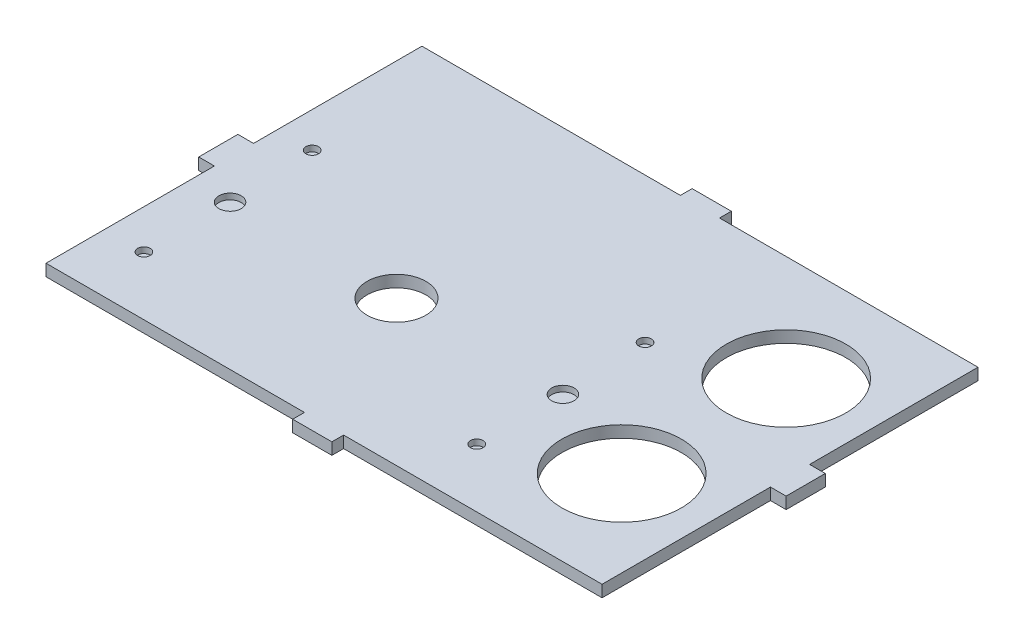
ISO-10303-21;
HEADER;
FILE_DESCRIPTION(('STEP AP214'),'2;1');
FILE_NAME('part.step','',(''),(''),'','','');
FILE_SCHEMA(('AUTOMOTIVE_DESIGN { 1 0 10303 214 1 1 1 1 }'));
ENDSEC;
DATA;
#1=APPLICATION_CONTEXT('core data for automotive mechanical design processes');
#2=APPLICATION_PROTOCOL_DEFINITION('international standard','automotive_design',2000,#1);
#3=PRODUCT_CONTEXT('',#1,'mechanical');
#4=PRODUCT('Part','Part','',(#3));
#5=PRODUCT_RELATED_PRODUCT_CATEGORY('part','',(#4));
#6=PRODUCT_DEFINITION_FORMATION('','',#4);
#7=PRODUCT_DEFINITION_CONTEXT('part definition',#1,'design');
#8=PRODUCT_DEFINITION('design','',#6,#7);
#9=PRODUCT_DEFINITION_SHAPE('','',#8);
#10=(LENGTH_UNIT() NAMED_UNIT(*) SI_UNIT(.MILLI.,.METRE.));
#11=(NAMED_UNIT(*) PLANE_ANGLE_UNIT() SI_UNIT($,.RADIAN.));
#12=(NAMED_UNIT(*) SI_UNIT($,.STERADIAN.) SOLID_ANGLE_UNIT());
#13=UNCERTAINTY_MEASURE_WITH_UNIT(LENGTH_MEASURE(1.E-05),#10,'distance_accuracy_value','');
#14=(GEOMETRIC_REPRESENTATION_CONTEXT(3) GLOBAL_UNCERTAINTY_ASSIGNED_CONTEXT((#13)) GLOBAL_UNIT_ASSIGNED_CONTEXT((#10,
#11,#12)) REPRESENTATION_CONTEXT('',''));
#15=CARTESIAN_POINT('',(0.,0.,0.));
#16=DIRECTION('',(0.,0.,1.));
#17=DIRECTION('',(1.,0.,0.));
#18=AXIS2_PLACEMENT_3D('',#15,#16,#17);
#19=CARTESIAN_POINT('',(4.99999999999998,3.,48.));
#20=DIRECTION('',(0.,0.,-1.));
#21=DIRECTION('',(-1.,0.,0.));
#22=AXIS2_PLACEMENT_3D('',#19,#20,#21);
#23=PLANE('',#22);
#24=DIRECTION('',(1.,0.,0.));
#25=VECTOR('',#24,1.);
#26=CARTESIAN_POINT('',(4.99999999999998,0.,48.));
#27=LINE('',#26,#25);
#28=CARTESIAN_POINT('',(4.99999999999998,0.,48.));
#29=VERTEX_POINT('',#28);
#30=CARTESIAN_POINT('',(71.,0.,48.));
#31=VERTEX_POINT('',#30);
#32=EDGE_CURVE('E203',#29,#31,#27,.T.);
#33=ORIENTED_EDGE('',*,*,#32,.T.);
#34=DIRECTION('',(0.,-1.,0.));
#35=VECTOR('',#34,1.);
#36=CARTESIAN_POINT('',(71.,3.,48.));
#37=LINE('',#36,#35);
#38=CARTESIAN_POINT('',(71.,3.,48.));
#39=VERTEX_POINT('',#38);
#40=EDGE_CURVE('E11',#39,#31,#37,.T.);
#41=ORIENTED_EDGE('',*,*,#40,.F.);
#42=DIRECTION('',(1.,0.,0.));
#43=VECTOR('',#42,1.);
#44=CARTESIAN_POINT('',(4.99999999999998,3.,48.));
#45=LINE('',#44,#43);
#46=CARTESIAN_POINT('',(4.99999999999998,3.,48.));
#47=VERTEX_POINT('',#46);
#48=EDGE_CURVE('E242',#47,#39,#45,.T.);
#49=ORIENTED_EDGE('',*,*,#48,.F.);
#50=DIRECTION('',(0.,-1.,0.));
#51=VECTOR('',#50,1.);
#52=CARTESIAN_POINT('',(4.99999999999998,3.,48.));
#53=LINE('',#52,#51);
#54=EDGE_CURVE('E199',#47,#29,#53,.T.);
#55=ORIENTED_EDGE('',*,*,#54,.T.);
#56=EDGE_LOOP('',(#33,#41,#49,#55));
#57=FACE_BOUND('',#56,.T.);
#58=ADVANCED_FACE('F35',(#57),#23,.F.);
#59=CARTESIAN_POINT('',(71.,3.,5.00000000000001));
#60=DIRECTION('',(-1.,0.,0.));
#61=DIRECTION('',(0.,0.,1.));
#62=AXIS2_PLACEMENT_3D('',#59,#60,#61);
#63=PLANE('',#62);
#64=DIRECTION('',(0.,0.,-1.));
#65=VECTOR('',#64,1.);
#66=CARTESIAN_POINT('',(71.,0.,5.00000000000001));
#67=LINE('',#66,#65);
#68=CARTESIAN_POINT('',(71.,0.,5.00000000000001));
#69=VERTEX_POINT('',#68);
#70=EDGE_CURVE('E206',#31,#69,#67,.T.);
#71=ORIENTED_EDGE('',*,*,#70,.T.);
#72=DIRECTION('',(0.,-1.,0.));
#73=VECTOR('',#72,1.);
#74=CARTESIAN_POINT('',(71.,3.,5.00000000000001));
#75=LINE('',#74,#73);
#76=CARTESIAN_POINT('',(71.,3.,5.00000000000001));
#77=VERTEX_POINT('',#76);
#78=EDGE_CURVE('E43',#77,#69,#75,.T.);
#79=ORIENTED_EDGE('',*,*,#78,.F.);
#80=DIRECTION('',(0.,0.,-1.));
#81=VECTOR('',#80,1.);
#82=CARTESIAN_POINT('',(71.,3.,5.00000000000001));
#83=LINE('',#82,#81);
#84=EDGE_CURVE('E130',#39,#77,#83,.T.);
#85=ORIENTED_EDGE('',*,*,#84,.F.);
#86=ORIENTED_EDGE('',*,*,#40,.T.);
#87=EDGE_LOOP('',(#71,#79,#85,#86));
#88=FACE_BOUND('',#87,.T.);
#89=ADVANCED_FACE('F361',(#88),#63,.F.);
#90=CARTESIAN_POINT('',(71.,3.,5.00000000000001));
#91=DIRECTION('',(0.,0.,-1.));
#92=DIRECTION('',(-1.,0.,0.));
#93=AXIS2_PLACEMENT_3D('',#90,#91,#92);
#94=PLANE('',#93);
#95=DIRECTION('',(1.,0.,0.));
#96=VECTOR('',#95,1.);
#97=CARTESIAN_POINT('',(71.,0.,5.00000000000001));
#98=LINE('',#97,#96);
#99=CARTESIAN_POINT('',(75.,0.,5.00000000000001));
#100=VERTEX_POINT('',#99);
#101=EDGE_CURVE('E209',#69,#100,#98,.T.);
#102=ORIENTED_EDGE('',*,*,#101,.T.);
#103=DIRECTION('',(0.,-1.,0.));
#104=VECTOR('',#103,1.);
#105=CARTESIAN_POINT('',(75.,3.,5.00000000000001));
#106=LINE('',#105,#104);
#107=CARTESIAN_POINT('',(75.,3.,5.00000000000001));
#108=VERTEX_POINT('',#107);
#109=EDGE_CURVE('E285',#108,#100,#106,.T.);
#110=ORIENTED_EDGE('',*,*,#109,.F.);
#111=DIRECTION('',(1.,0.,0.));
#112=VECTOR('',#111,1.);
#113=CARTESIAN_POINT('',(71.,3.,5.00000000000001));
#114=LINE('',#113,#112);
#115=EDGE_CURVE('E293',#77,#108,#114,.T.);
#116=ORIENTED_EDGE('',*,*,#115,.F.);
#117=ORIENTED_EDGE('',*,*,#78,.T.);
#118=EDGE_LOOP('',(#102,#110,#116,#117));
#119=FACE_BOUND('',#118,.T.);
#120=ADVANCED_FACE('F291',(#119),#94,.F.);
#121=CARTESIAN_POINT('',(75.,3.,-4.99999999999999));
#122=DIRECTION('',(-1.,0.,0.));
#123=DIRECTION('',(0.,0.,1.));
#124=AXIS2_PLACEMENT_3D('',#121,#122,#123);
#125=PLANE('',#124);
#126=DIRECTION('',(0.,0.,-1.));
#127=VECTOR('',#126,1.);
#128=CARTESIAN_POINT('',(75.,0.,-4.99999999999999));
#129=LINE('',#128,#127);
#130=CARTESIAN_POINT('',(75.,0.,-4.99999999999999));
#131=VERTEX_POINT('',#130);
#132=EDGE_CURVE('E211',#100,#131,#129,.T.);
#133=ORIENTED_EDGE('',*,*,#132,.T.);
#134=DIRECTION('',(0.,-1.,0.));
#135=VECTOR('',#134,1.);
#136=CARTESIAN_POINT('',(75.,3.,-4.99999999999999));
#137=LINE('',#136,#135);
#138=CARTESIAN_POINT('',(75.,3.,-4.99999999999999));
#139=VERTEX_POINT('',#138);
#140=EDGE_CURVE('E282',#139,#131,#137,.T.);
#141=ORIENTED_EDGE('',*,*,#140,.F.);
#142=DIRECTION('',(0.,0.,-1.));
#143=VECTOR('',#142,1.);
#144=CARTESIAN_POINT('',(75.,3.,-4.99999999999999));
#145=LINE('',#144,#143);
#146=EDGE_CURVE('E311',#108,#139,#145,.T.);
#147=ORIENTED_EDGE('',*,*,#146,.F.);
#148=ORIENTED_EDGE('',*,*,#109,.T.);
#149=EDGE_LOOP('',(#133,#141,#147,#148));
#150=FACE_BOUND('',#149,.T.);
#151=ADVANCED_FACE('F302',(#150),#125,.F.);
#152=CARTESIAN_POINT('',(71.,3.,-4.99999999999999));
#153=DIRECTION('',(0.,0.,1.));
#154=DIRECTION('',(1.,0.,0.));
#155=AXIS2_PLACEMENT_3D('',#152,#153,#154);
#156=PLANE('',#155);
#157=DIRECTION('',(-1.,0.,0.));
#158=VECTOR('',#157,1.);
#159=CARTESIAN_POINT('',(71.,0.,-4.99999999999999));
#160=LINE('',#159,#158);
#161=CARTESIAN_POINT('',(71.,0.,-4.99999999999999));
#162=VERTEX_POINT('',#161);
#163=EDGE_CURVE('E213',#131,#162,#160,.T.);
#164=ORIENTED_EDGE('',*,*,#163,.T.);
#165=DIRECTION('',(0.,-1.,0.));
#166=VECTOR('',#165,1.);
#167=CARTESIAN_POINT('',(71.,3.,-4.99999999999999));
#168=LINE('',#167,#166);
#169=CARTESIAN_POINT('',(71.,3.,-4.99999999999999));
#170=VERTEX_POINT('',#169);
#171=EDGE_CURVE('E279',#170,#162,#168,.T.);
#172=ORIENTED_EDGE('',*,*,#171,.F.);
#173=DIRECTION('',(-1.,0.,0.));
#174=VECTOR('',#173,1.);
#175=CARTESIAN_POINT('',(71.,3.,-4.99999999999999));
#176=LINE('',#175,#174);
#177=EDGE_CURVE('E308',#139,#170,#176,.T.);
#178=ORIENTED_EDGE('',*,*,#177,.F.);
#179=ORIENTED_EDGE('',*,*,#140,.T.);
#180=EDGE_LOOP('',(#164,#172,#178,#179));
#181=FACE_BOUND('',#180,.T.);
#182=ADVANCED_FACE('F306',(#181),#156,.F.);
#183=CARTESIAN_POINT('',(71.,3.,-48.));
#184=DIRECTION('',(-1.,0.,0.));
#185=DIRECTION('',(0.,0.,1.));
#186=AXIS2_PLACEMENT_3D('',#183,#184,#185);
#187=PLANE('',#186);
#188=DIRECTION('',(0.,0.,-1.));
#189=VECTOR('',#188,1.);
#190=CARTESIAN_POINT('',(71.,0.,-48.));
#191=LINE('',#190,#189);
#192=CARTESIAN_POINT('',(71.,0.,-48.));
#193=VERTEX_POINT('',#192);
#194=EDGE_CURVE('E215',#162,#193,#191,.T.);
#195=ORIENTED_EDGE('',*,*,#194,.T.);
#196=DIRECTION('',(0.,-1.,0.));
#197=VECTOR('',#196,1.);
#198=CARTESIAN_POINT('',(71.,3.,-48.));
#199=LINE('',#198,#197);
#200=CARTESIAN_POINT('',(71.,3.,-48.));
#201=VERTEX_POINT('',#200);
#202=EDGE_CURVE('E276',#201,#193,#199,.T.);
#203=ORIENTED_EDGE('',*,*,#202,.F.);
#204=DIRECTION('',(0.,0.,-1.));
#205=VECTOR('',#204,1.);
#206=CARTESIAN_POINT('',(71.,3.,-48.));
#207=LINE('',#206,#205);
#208=EDGE_CURVE('E310',#170,#201,#207,.T.);
#209=ORIENTED_EDGE('',*,*,#208,.F.);
#210=ORIENTED_EDGE('',*,*,#171,.T.);
#211=EDGE_LOOP('',(#195,#203,#209,#210));
#212=FACE_BOUND('',#211,.T.);
#213=ADVANCED_FACE('F374',(#212),#187,.F.);
#214=CARTESIAN_POINT('',(4.99999999999998,3.,-48.));
#215=DIRECTION('',(0.,0.,1.));
#216=DIRECTION('',(1.,0.,0.));
#217=AXIS2_PLACEMENT_3D('',#214,#215,#216);
#218=PLANE('',#217);
#219=DIRECTION('',(-1.,0.,0.));
#220=VECTOR('',#219,1.);
#221=CARTESIAN_POINT('',(4.99999999999998,0.,-48.));
#222=LINE('',#221,#220);
#223=CARTESIAN_POINT('',(4.99999999999998,0.,-48.));
#224=VERTEX_POINT('',#223);
#225=EDGE_CURVE('E217',#193,#224,#222,.T.);
#226=ORIENTED_EDGE('',*,*,#225,.T.);
#227=DIRECTION('',(0.,-1.,0.));
#228=VECTOR('',#227,1.);
#229=CARTESIAN_POINT('',(4.99999999999998,3.,-48.));
#230=LINE('',#229,#228);
#231=CARTESIAN_POINT('',(4.99999999999998,3.,-48.));
#232=VERTEX_POINT('',#231);
#233=EDGE_CURVE('E273',#232,#224,#230,.T.);
#234=ORIENTED_EDGE('',*,*,#233,.F.);
#235=DIRECTION('',(-1.,0.,0.));
#236=VECTOR('',#235,1.);
#237=CARTESIAN_POINT('',(4.99999999999998,3.,-48.));
#238=LINE('',#237,#236);
#239=EDGE_CURVE('E313',#201,#232,#238,.T.);
#240=ORIENTED_EDGE('',*,*,#239,.F.);
#241=ORIENTED_EDGE('',*,*,#202,.T.);
#242=EDGE_LOOP('',(#226,#234,#240,#241));
#243=FACE_BOUND('',#242,.T.);
#244=ADVANCED_FACE('F377',(#243),#218,.F.);
#245=CARTESIAN_POINT('',(4.99999999999998,3.,-48.));
#246=DIRECTION('',(-1.,0.,0.));
#247=DIRECTION('',(0.,0.,1.));
#248=AXIS2_PLACEMENT_3D('',#245,#246,#247);
#249=PLANE('',#248);
#250=DIRECTION('',(0.,0.,-1.));
#251=VECTOR('',#250,1.);
#252=CARTESIAN_POINT('',(4.99999999999998,0.,-48.));
#253=LINE('',#252,#251);
#254=CARTESIAN_POINT('',(4.99999999999998,0.,-51.));
#255=VERTEX_POINT('',#254);
#256=EDGE_CURVE('E219',#224,#255,#253,.T.);
#257=ORIENTED_EDGE('',*,*,#256,.T.);
#258=DIRECTION('',(0.,-1.,0.));
#259=VECTOR('',#258,1.);
#260=CARTESIAN_POINT('',(4.99999999999998,3.,-51.));
#261=LINE('',#260,#259);
#262=CARTESIAN_POINT('',(4.99999999999998,3.,-51.));
#263=VERTEX_POINT('',#262);
#264=EDGE_CURVE('E270',#263,#255,#261,.T.);
#265=ORIENTED_EDGE('',*,*,#264,.F.);
#266=DIRECTION('',(0.,0.,-1.));
#267=VECTOR('',#266,1.);
#268=CARTESIAN_POINT('',(4.99999999999998,3.,-48.));
#269=LINE('',#268,#267);
#270=EDGE_CURVE('E319',#232,#263,#269,.T.);
#271=ORIENTED_EDGE('',*,*,#270,.F.);
#272=ORIENTED_EDGE('',*,*,#233,.T.);
#273=EDGE_LOOP('',(#257,#265,#271,#272));
#274=FACE_BOUND('',#273,.T.);
#275=ADVANCED_FACE('F381',(#274),#249,.F.);
#276=CARTESIAN_POINT('',(-5.00000000000002,3.,-51.));
#277=DIRECTION('',(0.,0.,1.));
#278=DIRECTION('',(1.,0.,0.));
#279=AXIS2_PLACEMENT_3D('',#276,#277,#278);
#280=PLANE('',#279);
#281=DIRECTION('',(-1.,0.,0.));
#282=VECTOR('',#281,1.);
#283=CARTESIAN_POINT('',(-5.00000000000002,0.,-51.));
#284=LINE('',#283,#282);
#285=CARTESIAN_POINT('',(-5.00000000000002,0.,-51.));
#286=VERTEX_POINT('',#285);
#287=EDGE_CURVE('E221',#255,#286,#284,.T.);
#288=ORIENTED_EDGE('',*,*,#287,.T.);
#289=DIRECTION('',(0.,-1.,0.));
#290=VECTOR('',#289,1.);
#291=CARTESIAN_POINT('',(-5.00000000000002,3.,-51.));
#292=LINE('',#291,#290);
#293=CARTESIAN_POINT('',(-5.00000000000002,3.,-51.));
#294=VERTEX_POINT('',#293);
#295=EDGE_CURVE('E267',#294,#286,#292,.T.);
#296=ORIENTED_EDGE('',*,*,#295,.F.);
#297=DIRECTION('',(-1.,0.,0.));
#298=VECTOR('',#297,1.);
#299=CARTESIAN_POINT('',(-5.00000000000002,3.,-51.));
#300=LINE('',#299,#298);
#301=EDGE_CURVE('E321',#263,#294,#300,.T.);
#302=ORIENTED_EDGE('',*,*,#301,.F.);
#303=ORIENTED_EDGE('',*,*,#264,.T.);
#304=EDGE_LOOP('',(#288,#296,#302,#303));
#305=FACE_BOUND('',#304,.T.);
#306=ADVANCED_FACE('F385',(#305),#280,.F.);
#307=CARTESIAN_POINT('',(-5.00000000000002,3.,-48.));
#308=DIRECTION('',(1.,0.,0.));
#309=DIRECTION('',(0.,0.,-1.));
#310=AXIS2_PLACEMENT_3D('',#307,#308,#309);
#311=PLANE('',#310);
#312=DIRECTION('',(0.,0.,1.));
#313=VECTOR('',#312,1.);
#314=CARTESIAN_POINT('',(-5.00000000000002,0.,-48.));
#315=LINE('',#314,#313);
#316=CARTESIAN_POINT('',(-5.00000000000002,0.,-48.));
#317=VERTEX_POINT('',#316);
#318=EDGE_CURVE('E223',#286,#317,#315,.T.);
#319=ORIENTED_EDGE('',*,*,#318,.T.);
#320=DIRECTION('',(0.,-1.,0.));
#321=VECTOR('',#320,1.);
#322=CARTESIAN_POINT('',(-5.00000000000002,3.,-48.));
#323=LINE('',#322,#321);
#324=CARTESIAN_POINT('',(-5.00000000000002,3.,-48.));
#325=VERTEX_POINT('',#324);
#326=EDGE_CURVE('E264',#325,#317,#323,.T.);
#327=ORIENTED_EDGE('',*,*,#326,.F.);
#328=DIRECTION('',(0.,0.,1.));
#329=VECTOR('',#328,1.);
#330=CARTESIAN_POINT('',(-5.00000000000002,3.,-48.));
#331=LINE('',#330,#329);
#332=EDGE_CURVE('E323',#294,#325,#331,.T.);
#333=ORIENTED_EDGE('',*,*,#332,.F.);
#334=ORIENTED_EDGE('',*,*,#295,.T.);
#335=EDGE_LOOP('',(#319,#327,#333,#334));
#336=FACE_BOUND('',#335,.T.);
#337=ADVANCED_FACE('F389',(#336),#311,.F.);
#338=CARTESIAN_POINT('',(-71.,3.,-48.));
#339=DIRECTION('',(0.,0.,1.));
#340=DIRECTION('',(1.,0.,0.));
#341=AXIS2_PLACEMENT_3D('',#338,#339,#340);
#342=PLANE('',#341);
#343=DIRECTION('',(-1.,0.,0.));
#344=VECTOR('',#343,1.);
#345=CARTESIAN_POINT('',(-71.,0.,-48.));
#346=LINE('',#345,#344);
#347=CARTESIAN_POINT('',(-71.,0.,-48.));
#348=VERTEX_POINT('',#347);
#349=EDGE_CURVE('E225',#317,#348,#346,.T.);
#350=ORIENTED_EDGE('',*,*,#349,.T.);
#351=DIRECTION('',(0.,-1.,0.));
#352=VECTOR('',#351,1.);
#353=CARTESIAN_POINT('',(-71.,3.,-48.));
#354=LINE('',#353,#352);
#355=CARTESIAN_POINT('',(-71.,3.,-48.));
#356=VERTEX_POINT('',#355);
#357=EDGE_CURVE('E261',#356,#348,#354,.T.);
#358=ORIENTED_EDGE('',*,*,#357,.F.);
#359=DIRECTION('',(-1.,0.,0.));
#360=VECTOR('',#359,1.);
#361=CARTESIAN_POINT('',(-71.,3.,-48.));
#362=LINE('',#361,#360);
#363=EDGE_CURVE('E325',#325,#356,#362,.T.);
#364=ORIENTED_EDGE('',*,*,#363,.F.);
#365=ORIENTED_EDGE('',*,*,#326,.T.);
#366=EDGE_LOOP('',(#350,#358,#364,#365));
#367=FACE_BOUND('',#366,.T.);
#368=ADVANCED_FACE('F393',(#367),#342,.F.);
#369=CARTESIAN_POINT('',(-71.,3.,-48.));
#370=DIRECTION('',(1.,0.,0.));
#371=DIRECTION('',(0.,0.,-1.));
#372=AXIS2_PLACEMENT_3D('',#369,#370,#371);
#373=PLANE('',#372);
#374=DIRECTION('',(0.,0.,1.));
#375=VECTOR('',#374,1.);
#376=CARTESIAN_POINT('',(-71.,0.,-48.));
#377=LINE('',#376,#375);
#378=CARTESIAN_POINT('',(-71.,0.,-4.99999999999999));
#379=VERTEX_POINT('',#378);
#380=EDGE_CURVE('E227',#348,#379,#377,.T.);
#381=ORIENTED_EDGE('',*,*,#380,.T.);
#382=DIRECTION('',(0.,-1.,0.));
#383=VECTOR('',#382,1.);
#384=CARTESIAN_POINT('',(-71.,3.,-4.99999999999999));
#385=LINE('',#384,#383);
#386=CARTESIAN_POINT('',(-71.,3.,-4.99999999999999));
#387=VERTEX_POINT('',#386);
#388=EDGE_CURVE('E258',#387,#379,#385,.T.);
#389=ORIENTED_EDGE('',*,*,#388,.F.);
#390=DIRECTION('',(0.,0.,1.));
#391=VECTOR('',#390,1.);
#392=CARTESIAN_POINT('',(-71.,3.,-48.));
#393=LINE('',#392,#391);
#394=EDGE_CURVE('E327',#356,#387,#393,.T.);
#395=ORIENTED_EDGE('',*,*,#394,.F.);
#396=ORIENTED_EDGE('',*,*,#357,.T.);
#397=EDGE_LOOP('',(#381,#389,#395,#396));
#398=FACE_BOUND('',#397,.T.);
#399=ADVANCED_FACE('F397',(#398),#373,.F.);
#400=CARTESIAN_POINT('',(-75.,3.,-4.99999999999999));
#401=DIRECTION('',(0.,0.,1.));
#402=DIRECTION('',(1.,0.,0.));
#403=AXIS2_PLACEMENT_3D('',#400,#401,#402);
#404=PLANE('',#403);
#405=DIRECTION('',(-1.,0.,0.));
#406=VECTOR('',#405,1.);
#407=CARTESIAN_POINT('',(-75.,0.,-4.99999999999999));
#408=LINE('',#407,#406);
#409=CARTESIAN_POINT('',(-75.,0.,-4.99999999999999));
#410=VERTEX_POINT('',#409);
#411=EDGE_CURVE('E229',#379,#410,#408,.T.);
#412=ORIENTED_EDGE('',*,*,#411,.T.);
#413=DIRECTION('',(0.,-1.,0.));
#414=VECTOR('',#413,1.);
#415=CARTESIAN_POINT('',(-75.,3.,-4.99999999999999));
#416=LINE('',#415,#414);
#417=CARTESIAN_POINT('',(-75.,3.,-4.99999999999999));
#418=VERTEX_POINT('',#417);
#419=EDGE_CURVE('E255',#418,#410,#416,.T.);
#420=ORIENTED_EDGE('',*,*,#419,.F.);
#421=DIRECTION('',(-1.,0.,0.));
#422=VECTOR('',#421,1.);
#423=CARTESIAN_POINT('',(-75.,3.,-4.99999999999999));
#424=LINE('',#423,#422);
#425=EDGE_CURVE('E329',#387,#418,#424,.T.);
#426=ORIENTED_EDGE('',*,*,#425,.F.);
#427=ORIENTED_EDGE('',*,*,#388,.T.);
#428=EDGE_LOOP('',(#412,#420,#426,#427));
#429=FACE_BOUND('',#428,.T.);
#430=ADVANCED_FACE('F401',(#429),#404,.F.);
#431=CARTESIAN_POINT('',(-75.,3.,-4.99999999999999));
#432=DIRECTION('',(1.,0.,0.));
#433=DIRECTION('',(0.,0.,-1.));
#434=AXIS2_PLACEMENT_3D('',#431,#432,#433);
#435=PLANE('',#434);
#436=DIRECTION('',(0.,0.,1.));
#437=VECTOR('',#436,1.);
#438=CARTESIAN_POINT('',(-75.,0.,-4.99999999999999));
#439=LINE('',#438,#437);
#440=CARTESIAN_POINT('',(-75.,0.,5.00000000000001));
#441=VERTEX_POINT('',#440);
#442=EDGE_CURVE('E231',#410,#441,#439,.T.);
#443=ORIENTED_EDGE('',*,*,#442,.T.);
#444=DIRECTION('',(0.,-1.,0.));
#445=VECTOR('',#444,1.);
#446=CARTESIAN_POINT('',(-75.,3.,5.00000000000001));
#447=LINE('',#446,#445);
#448=CARTESIAN_POINT('',(-75.,3.,5.00000000000001));
#449=VERTEX_POINT('',#448);
#450=EDGE_CURVE('E252',#449,#441,#447,.T.);
#451=ORIENTED_EDGE('',*,*,#450,.F.);
#452=DIRECTION('',(0.,0.,1.));
#453=VECTOR('',#452,1.);
#454=CARTESIAN_POINT('',(-75.,3.,-4.99999999999999));
#455=LINE('',#454,#453);
#456=EDGE_CURVE('E331',#418,#449,#455,.T.);
#457=ORIENTED_EDGE('',*,*,#456,.F.);
#458=ORIENTED_EDGE('',*,*,#419,.T.);
#459=EDGE_LOOP('',(#443,#451,#457,#458));
#460=FACE_BOUND('',#459,.T.);
#461=ADVANCED_FACE('F405',(#460),#435,.F.);
#462=CARTESIAN_POINT('',(-75.,3.,5.00000000000001));
#463=DIRECTION('',(0.,0.,-1.));
#464=DIRECTION('',(-1.,0.,0.));
#465=AXIS2_PLACEMENT_3D('',#462,#463,#464);
#466=PLANE('',#465);
#467=DIRECTION('',(1.,0.,0.));
#468=VECTOR('',#467,1.);
#469=CARTESIAN_POINT('',(-75.,0.,5.00000000000001));
#470=LINE('',#469,#468);
#471=CARTESIAN_POINT('',(-71.,0.,5.00000000000001));
#472=VERTEX_POINT('',#471);
#473=EDGE_CURVE('E233',#441,#472,#470,.T.);
#474=ORIENTED_EDGE('',*,*,#473,.T.);
#475=DIRECTION('',(0.,-1.,0.));
#476=VECTOR('',#475,1.);
#477=CARTESIAN_POINT('',(-71.,3.,5.00000000000001));
#478=LINE('',#477,#476);
#479=CARTESIAN_POINT('',(-71.,3.,5.00000000000001));
#480=VERTEX_POINT('',#479);
#481=EDGE_CURVE('E249',#480,#472,#478,.T.);
#482=ORIENTED_EDGE('',*,*,#481,.F.);
#483=DIRECTION('',(1.,0.,0.));
#484=VECTOR('',#483,1.);
#485=CARTESIAN_POINT('',(-75.,3.,5.00000000000001));
#486=LINE('',#485,#484);
#487=EDGE_CURVE('E333',#449,#480,#486,.T.);
#488=ORIENTED_EDGE('',*,*,#487,.F.);
#489=ORIENTED_EDGE('',*,*,#450,.T.);
#490=EDGE_LOOP('',(#474,#482,#488,#489));
#491=FACE_BOUND('',#490,.T.);
#492=ADVANCED_FACE('F409',(#491),#466,.F.);
#493=CARTESIAN_POINT('',(-71.,3.,5.00000000000001));
#494=DIRECTION('',(1.,0.,0.));
#495=DIRECTION('',(0.,0.,-1.));
#496=AXIS2_PLACEMENT_3D('',#493,#494,#495);
#497=PLANE('',#496);
#498=DIRECTION('',(0.,0.,1.));
#499=VECTOR('',#498,1.);
#500=CARTESIAN_POINT('',(-71.,0.,5.00000000000001));
#501=LINE('',#500,#499);
#502=CARTESIAN_POINT('',(-71.,0.,48.));
#503=VERTEX_POINT('',#502);
#504=EDGE_CURVE('E235',#472,#503,#501,.T.);
#505=ORIENTED_EDGE('',*,*,#504,.T.);
#506=DIRECTION('',(0.,-1.,0.));
#507=VECTOR('',#506,1.);
#508=CARTESIAN_POINT('',(-71.,3.,48.));
#509=LINE('',#508,#507);
#510=CARTESIAN_POINT('',(-71.,3.,48.));
#511=VERTEX_POINT('',#510);
#512=EDGE_CURVE('E246',#511,#503,#509,.T.);
#513=ORIENTED_EDGE('',*,*,#512,.F.);
#514=DIRECTION('',(0.,0.,1.));
#515=VECTOR('',#514,1.);
#516=CARTESIAN_POINT('',(-71.,3.,5.00000000000001));
#517=LINE('',#516,#515);
#518=EDGE_CURVE('E335',#480,#511,#517,.T.);
#519=ORIENTED_EDGE('',*,*,#518,.F.);
#520=ORIENTED_EDGE('',*,*,#481,.T.);
#521=EDGE_LOOP('',(#505,#513,#519,#520));
#522=FACE_BOUND('',#521,.T.);
#523=ADVANCED_FACE('F341',(#522),#497,.F.);
#524=CARTESIAN_POINT('',(-71.,3.,48.));
#525=DIRECTION('',(0.,0.,-1.));
#526=DIRECTION('',(-1.,0.,0.));
#527=AXIS2_PLACEMENT_3D('',#524,#525,#526);
#528=PLANE('',#527);
#529=DIRECTION('',(1.,0.,0.));
#530=VECTOR('',#529,1.);
#531=CARTESIAN_POINT('',(-71.,0.,48.));
#532=LINE('',#531,#530);
#533=CARTESIAN_POINT('',(-5.00000000000002,0.,48.));
#534=VERTEX_POINT('',#533);
#535=EDGE_CURVE('E237',#503,#534,#532,.T.);
#536=ORIENTED_EDGE('',*,*,#535,.T.);
#537=DIRECTION('',(0.,-1.,0.));
#538=VECTOR('',#537,1.);
#539=CARTESIAN_POINT('',(-5.00000000000002,3.,48.));
#540=LINE('',#539,#538);
#541=CARTESIAN_POINT('',(-5.00000000000002,3.,48.));
#542=VERTEX_POINT('',#541);
#543=EDGE_CURVE('E194',#542,#534,#540,.T.);
#544=ORIENTED_EDGE('',*,*,#543,.F.);
#545=DIRECTION('',(1.,0.,0.));
#546=VECTOR('',#545,1.);
#547=CARTESIAN_POINT('',(-71.,3.,48.));
#548=LINE('',#547,#546);
#549=EDGE_CURVE('E185',#511,#542,#548,.T.);
#550=ORIENTED_EDGE('',*,*,#549,.F.);
#551=ORIENTED_EDGE('',*,*,#512,.T.);
#552=EDGE_LOOP('',(#536,#544,#550,#551));
#553=FACE_BOUND('',#552,.T.);
#554=ADVANCED_FACE('F345',(#553),#528,.F.);
#555=CARTESIAN_POINT('',(-5.00000000000002,3.,51.));
#556=DIRECTION('',(1.,0.,0.));
#557=DIRECTION('',(0.,0.,-1.));
#558=AXIS2_PLACEMENT_3D('',#555,#556,#557);
#559=PLANE('',#558);
#560=DIRECTION('',(0.,0.,1.));
#561=VECTOR('',#560,1.);
#562=CARTESIAN_POINT('',(-5.00000000000002,0.,51.));
#563=LINE('',#562,#561);
#564=CARTESIAN_POINT('',(-5.00000000000002,0.,51.));
#565=VERTEX_POINT('',#564);
#566=EDGE_CURVE('E193',#534,#565,#563,.T.);
#567=ORIENTED_EDGE('',*,*,#566,.T.);
#568=DIRECTION('',(0.,-1.,0.));
#569=VECTOR('',#568,1.);
#570=CARTESIAN_POINT('',(-5.00000000000002,3.,51.));
#571=LINE('',#570,#569);
#572=CARTESIAN_POINT('',(-5.00000000000002,3.,51.));
#573=VERTEX_POINT('',#572);
#574=EDGE_CURVE('E190',#573,#565,#571,.T.);
#575=ORIENTED_EDGE('',*,*,#574,.F.);
#576=DIRECTION('',(0.,0.,1.));
#577=VECTOR('',#576,1.);
#578=CARTESIAN_POINT('',(-5.00000000000002,3.,51.));
#579=LINE('',#578,#577);
#580=EDGE_CURVE('E179',#542,#573,#579,.T.);
#581=ORIENTED_EDGE('',*,*,#580,.F.);
#582=ORIENTED_EDGE('',*,*,#543,.T.);
#583=EDGE_LOOP('',(#567,#575,#581,#582));
#584=FACE_BOUND('',#583,.T.);
#585=ADVANCED_FACE('F191',(#584),#559,.F.);
#586=CARTESIAN_POINT('',(-5.00000000000002,3.,51.));
#587=DIRECTION('',(0.,0.,-1.));
#588=DIRECTION('',(-1.,0.,0.));
#589=AXIS2_PLACEMENT_3D('',#586,#587,#588);
#590=PLANE('',#589);
#591=DIRECTION('',(1.,0.,0.));
#592=VECTOR('',#591,1.);
#593=CARTESIAN_POINT('',(-5.00000000000002,0.,51.));
#594=LINE('',#593,#592);
#595=CARTESIAN_POINT('',(4.99999999999998,0.,51.));
#596=VERTEX_POINT('',#595);
#597=EDGE_CURVE('E116',#565,#596,#594,.T.);
#598=ORIENTED_EDGE('',*,*,#597,.T.);
#599=DIRECTION('',(0.,-1.,0.));
#600=VECTOR('',#599,1.);
#601=CARTESIAN_POINT('',(4.99999999999998,3.,51.));
#602=LINE('',#601,#600);
#603=CARTESIAN_POINT('',(4.99999999999998,3.,51.));
#604=VERTEX_POINT('',#603);
#605=EDGE_CURVE('E195',#604,#596,#602,.T.);
#606=ORIENTED_EDGE('',*,*,#605,.F.);
#607=DIRECTION('',(1.,0.,0.));
#608=VECTOR('',#607,1.);
#609=CARTESIAN_POINT('',(-5.00000000000002,3.,51.));
#610=LINE('',#609,#608);
#611=EDGE_CURVE('E183',#573,#604,#610,.T.);
#612=ORIENTED_EDGE('',*,*,#611,.F.);
#613=ORIENTED_EDGE('',*,*,#574,.T.);
#614=EDGE_LOOP('',(#598,#606,#612,#613));
#615=FACE_BOUND('',#614,.T.);
#616=ADVANCED_FACE('F197',(#615),#590,.F.);
#617=CARTESIAN_POINT('',(4.99999999999998,3.,51.));
#618=DIRECTION('',(-1.,0.,0.));
#619=DIRECTION('',(0.,0.,1.));
#620=AXIS2_PLACEMENT_3D('',#617,#618,#619);
#621=PLANE('',#620);
#622=DIRECTION('',(0.,0.,-1.));
#623=VECTOR('',#622,1.);
#624=CARTESIAN_POINT('',(4.99999999999998,0.,51.));
#625=LINE('',#624,#623);
#626=EDGE_CURVE('E122',#596,#29,#625,.T.);
#627=ORIENTED_EDGE('',*,*,#626,.T.);
#628=ORIENTED_EDGE('',*,*,#54,.F.);
#629=DIRECTION('',(0.,0.,-1.));
#630=VECTOR('',#629,1.);
#631=CARTESIAN_POINT('',(4.99999999999998,3.,51.));
#632=LINE('',#631,#630);
#633=EDGE_CURVE('E51',#604,#47,#632,.T.);
#634=ORIENTED_EDGE('',*,*,#633,.F.);
#635=ORIENTED_EDGE('',*,*,#605,.T.);
#636=EDGE_LOOP('',(#627,#628,#634,#635));
#637=FACE_BOUND('',#636,.T.);
#638=ADVANCED_FACE('F349',(#637),#621,.F.);
#639=CARTESIAN_POINT('',(0.,3.,0.));
#640=DIRECTION('',(0.,-1.,0.));
#641=DIRECTION('',(0.,0.,-1.));
#642=AXIS2_PLACEMENT_3D('',#639,#640,#641);
#643=PLANE('',#642);
#644=CARTESIAN_POINT('',(49.,3.,-21.));
#645=DIRECTION('',(0.,1.,0.));
#646=DIRECTION('',(0.,0.,1.));
#647=AXIS2_PLACEMENT_3D('',#644,#645,#646);
#648=CIRCLE('',#647,15.25);
#649=CARTESIAN_POINT('',(49.,3.,-5.75000000000002));
#650=VERTEX_POINT('',#649);
#651=EDGE_CURVE('E605',#650,#650,#648,.T.);
#652=ORIENTED_EDGE('',*,*,#651,.F.);
#653=EDGE_LOOP('',(#652));
#654=FACE_BOUND('',#653,.T.);
#655=CARTESIAN_POINT('',(49.,3.,21.));
#656=DIRECTION('',(0.,1.,0.));
#657=DIRECTION('',(0.,0.,1.));
#658=AXIS2_PLACEMENT_3D('',#655,#656,#657);
#659=CIRCLE('',#658,15.25);
#660=CARTESIAN_POINT('',(49.,3.,36.25));
#661=VERTEX_POINT('',#660);
#662=EDGE_CURVE('E607',#661,#661,#659,.T.);
#663=ORIENTED_EDGE('',*,*,#662,.F.);
#664=EDGE_LOOP('',(#663));
#665=FACE_BOUND('',#664,.T.);
#666=CARTESIAN_POINT('',(-18.5,3.,11.));
#667=DIRECTION('',(0.,1.,0.));
#668=DIRECTION('',(0.,0.,1.));
#669=AXIS2_PLACEMENT_3D('',#666,#667,#668);
#670=CIRCLE('',#669,7.5);
#671=CARTESIAN_POINT('',(-18.5,3.,18.5));
#672=VERTEX_POINT('',#671);
#673=EDGE_CURVE('E613',#672,#672,#670,.T.);
#674=ORIENTED_EDGE('',*,*,#673,.F.);
#675=EDGE_LOOP('',(#674));
#676=FACE_BOUND('',#675,.T.);
#677=CARTESIAN_POINT('',(23.0010314597897,3.,-10.9773078846266));
#678=DIRECTION('',(0.,1.,0.));
#679=DIRECTION('',(0.,0.,1.));
#680=AXIS2_PLACEMENT_3D('',#677,#678,#679);
#681=CIRCLE('',#680,1.6);
#682=CARTESIAN_POINT('',(23.0010314597897,3.,-9.3773078846266));
#683=VERTEX_POINT('',#682);
#684=EDGE_CURVE('E619',#683,#683,#681,.T.);
#685=ORIENTED_EDGE('',*,*,#684,.F.);
#686=EDGE_LOOP('',(#685));
#687=FACE_BOUND('',#686,.T.);
#688=CARTESIAN_POINT('',(-61.9989685402103,3.,-10.9773078846266));
#689=DIRECTION('',(0.,1.,0.));
#690=DIRECTION('',(0.,0.,1.));
#691=AXIS2_PLACEMENT_3D('',#688,#689,#690);
#692=CIRCLE('',#691,1.6);
#693=CARTESIAN_POINT('',(-61.9989685402103,3.,-9.3773078846266));
#694=VERTEX_POINT('',#693);
#695=EDGE_CURVE('E625',#694,#694,#692,.T.);
#696=ORIENTED_EDGE('',*,*,#695,.F.);
#697=EDGE_LOOP('',(#696));
#698=FACE_BOUND('',#697,.T.);
#699=CARTESIAN_POINT('',(24.,3.,11.));
#700=DIRECTION('',(0.,1.,0.));
#701=DIRECTION('',(0.,0.,1.));
#702=AXIS2_PLACEMENT_3D('',#699,#700,#701);
#703=CIRCLE('',#702,2.85);
#704=CARTESIAN_POINT('',(24.,3.,13.85));
#705=VERTEX_POINT('',#704);
#706=EDGE_CURVE('E631',#705,#705,#703,.T.);
#707=ORIENTED_EDGE('',*,*,#706,.F.);
#708=EDGE_LOOP('',(#707));
#709=FACE_BOUND('',#708,.T.);
#710=CARTESIAN_POINT('',(-61.,3.,11.));
#711=DIRECTION('',(0.,1.,0.));
#712=DIRECTION('',(0.,0.,1.));
#713=AXIS2_PLACEMENT_3D('',#710,#711,#712);
#714=CIRCLE('',#713,2.85);
#715=CARTESIAN_POINT('',(-61.,3.,13.85));
#716=VERTEX_POINT('',#715);
#717=EDGE_CURVE('E637',#716,#716,#714,.T.);
#718=ORIENTED_EDGE('',*,*,#717,.F.);
#719=EDGE_LOOP('',(#718));
#720=FACE_BOUND('',#719,.T.);
#721=CARTESIAN_POINT('',(24.,3.,33.));
#722=DIRECTION('',(0.,1.,0.));
#723=DIRECTION('',(0.,0.,1.));
#724=AXIS2_PLACEMENT_3D('',#721,#722,#723);
#725=CIRCLE('',#724,1.6);
#726=CARTESIAN_POINT('',(24.,3.,34.6));
#727=VERTEX_POINT('',#726);
#728=EDGE_CURVE('E643',#727,#727,#725,.T.);
#729=ORIENTED_EDGE('',*,*,#728,.F.);
#730=EDGE_LOOP('',(#729));
#731=FACE_BOUND('',#730,.T.);
#732=CARTESIAN_POINT('',(-61.,3.,33.));
#733=DIRECTION('',(0.,1.,0.));
#734=DIRECTION('',(0.,0.,1.));
#735=AXIS2_PLACEMENT_3D('',#732,#733,#734);
#736=CIRCLE('',#735,1.6);
#737=CARTESIAN_POINT('',(-61.,3.,34.6));
#738=VERTEX_POINT('',#737);
#739=EDGE_CURVE('E649',#738,#738,#736,.T.);
#740=ORIENTED_EDGE('',*,*,#739,.F.);
#741=EDGE_LOOP('',(#740));
#742=FACE_BOUND('',#741,.T.);
#743=ORIENTED_EDGE('',*,*,#48,.T.);
#744=ORIENTED_EDGE('',*,*,#84,.T.);
#745=ORIENTED_EDGE('',*,*,#115,.T.);
#746=ORIENTED_EDGE('',*,*,#146,.T.);
#747=ORIENTED_EDGE('',*,*,#177,.T.);
#748=ORIENTED_EDGE('',*,*,#208,.T.);
#749=ORIENTED_EDGE('',*,*,#239,.T.);
#750=ORIENTED_EDGE('',*,*,#270,.T.);
#751=ORIENTED_EDGE('',*,*,#301,.T.);
#752=ORIENTED_EDGE('',*,*,#332,.T.);
#753=ORIENTED_EDGE('',*,*,#363,.T.);
#754=ORIENTED_EDGE('',*,*,#394,.T.);
#755=ORIENTED_EDGE('',*,*,#425,.T.);
#756=ORIENTED_EDGE('',*,*,#456,.T.);
#757=ORIENTED_EDGE('',*,*,#487,.T.);
#758=ORIENTED_EDGE('',*,*,#518,.T.);
#759=ORIENTED_EDGE('',*,*,#549,.T.);
#760=ORIENTED_EDGE('',*,*,#580,.T.);
#761=ORIENTED_EDGE('',*,*,#611,.T.);
#762=ORIENTED_EDGE('',*,*,#633,.T.);
#763=EDGE_LOOP('',(#743,#744,#745,#746,#747,#748,#749,#750,#751,#752,#753,#754,#755,#756,#757,
#758,#759,#760,#761,#762));
#764=FACE_BOUND('',#763,.T.);
#765=ADVANCED_FACE('F181',(#654,#665,#676,#687,#698,#709,#720,#731,#742,#764),#643,.F.);
#766=CARTESIAN_POINT('',(0.,0.,0.));
#767=DIRECTION('',(0.,-1.,0.));
#768=DIRECTION('',(0.,0.,-1.));
#769=AXIS2_PLACEMENT_3D('',#766,#767,#768);
#770=PLANE('',#769);
#771=CARTESIAN_POINT('',(49.,0.,-21.));
#772=DIRECTION('',(0.,1.,0.));
#773=DIRECTION('',(0.,0.,1.));
#774=AXIS2_PLACEMENT_3D('',#771,#772,#773);
#775=CIRCLE('',#774,15.25);
#776=CARTESIAN_POINT('',(49.,0.,-5.75000000000002));
#777=VERTEX_POINT('',#776);
#778=EDGE_CURVE('E602',#777,#777,#775,.T.);
#779=ORIENTED_EDGE('',*,*,#778,.T.);
#780=EDGE_LOOP('',(#779));
#781=FACE_BOUND('',#780,.T.);
#782=CARTESIAN_POINT('',(49.,0.,21.));
#783=DIRECTION('',(0.,1.,0.));
#784=DIRECTION('',(0.,0.,1.));
#785=AXIS2_PLACEMENT_3D('',#782,#783,#784);
#786=CIRCLE('',#785,15.25);
#787=CARTESIAN_POINT('',(49.,0.,36.25));
#788=VERTEX_POINT('',#787);
#789=EDGE_CURVE('E610',#788,#788,#786,.T.);
#790=ORIENTED_EDGE('',*,*,#789,.T.);
#791=EDGE_LOOP('',(#790));
#792=FACE_BOUND('',#791,.T.);
#793=CARTESIAN_POINT('',(-18.5,0.,11.));
#794=DIRECTION('',(0.,1.,0.));
#795=DIRECTION('',(0.,0.,1.));
#796=AXIS2_PLACEMENT_3D('',#793,#794,#795);
#797=CIRCLE('',#796,7.5);
#798=CARTESIAN_POINT('',(-18.5,0.,18.5));
#799=VERTEX_POINT('',#798);
#800=EDGE_CURVE('E616',#799,#799,#797,.T.);
#801=ORIENTED_EDGE('',*,*,#800,.T.);
#802=EDGE_LOOP('',(#801));
#803=FACE_BOUND('',#802,.T.);
#804=ORIENTED_EDGE('',*,*,#32,.F.);
#805=ORIENTED_EDGE('',*,*,#626,.F.);
#806=ORIENTED_EDGE('',*,*,#597,.F.);
#807=ORIENTED_EDGE('',*,*,#566,.F.);
#808=ORIENTED_EDGE('',*,*,#535,.F.);
#809=ORIENTED_EDGE('',*,*,#504,.F.);
#810=ORIENTED_EDGE('',*,*,#473,.F.);
#811=ORIENTED_EDGE('',*,*,#442,.F.);
#812=ORIENTED_EDGE('',*,*,#411,.F.);
#813=ORIENTED_EDGE('',*,*,#380,.F.);
#814=ORIENTED_EDGE('',*,*,#349,.F.);
#815=ORIENTED_EDGE('',*,*,#318,.F.);
#816=ORIENTED_EDGE('',*,*,#287,.F.);
#817=ORIENTED_EDGE('',*,*,#256,.F.);
#818=ORIENTED_EDGE('',*,*,#225,.F.);
#819=ORIENTED_EDGE('',*,*,#194,.F.);
#820=ORIENTED_EDGE('',*,*,#163,.F.);
#821=ORIENTED_EDGE('',*,*,#132,.F.);
#822=ORIENTED_EDGE('',*,*,#101,.F.);
#823=ORIENTED_EDGE('',*,*,#70,.F.);
#824=EDGE_LOOP('',(#804,#805,#806,#807,#808,#809,#810,#811,#812,#813,#814,#815,#816,#817,#818,
#819,#820,#821,#822,#823));
#825=FACE_BOUND('',#824,.T.);
#826=ADVANCED_FACE('F297',(#781,#792,#803,#825),#770,.T.);
#827=CARTESIAN_POINT('',(-61.,1.5,33.));
#828=DIRECTION('',(0.,1.,0.));
#829=DIRECTION('',(0.,0.,1.));
#830=AXIS2_PLACEMENT_3D('',#827,#828,#829);
#831=CYLINDRICAL_SURFACE('',#830,1.6);
#832=CARTESIAN_POINT('',(-61.,1.5,33.));
#833=DIRECTION('',(0.,1.,0.));
#834=DIRECTION('',(0.,0.,1.));
#835=AXIS2_PLACEMENT_3D('',#832,#833,#834);
#836=CIRCLE('',#835,1.6);
#837=CARTESIAN_POINT('',(-61.,1.5,34.6));
#838=VERTEX_POINT('',#837);
#839=EDGE_CURVE('E207',#838,#838,#836,.T.);
#840=ORIENTED_EDGE('',*,*,#839,.F.);
#841=EDGE_LOOP('',(#840));
#842=FACE_BOUND('',#841,.T.);
#843=ORIENTED_EDGE('',*,*,#739,.T.);
#844=EDGE_LOOP('',(#843));
#845=FACE_BOUND('',#844,.T.);
#846=ADVANCED_FACE('F437',(#842,#845),#831,.F.);
#847=CARTESIAN_POINT('',(-61.,1.5,33.));
#848=DIRECTION('',(0.,1.,0.));
#849=DIRECTION('',(0.,0.,1.));
#850=AXIS2_PLACEMENT_3D('',#847,#848,#849);
#851=PLANE('',#850);
#852=ORIENTED_EDGE('',*,*,#839,.T.);
#853=EDGE_LOOP('',(#852));
#854=FACE_BOUND('',#853,.T.);
#855=ADVANCED_FACE('F442',(#854),#851,.T.);
#856=CARTESIAN_POINT('',(24.,1.5,33.));
#857=DIRECTION('',(0.,1.,0.));
#858=DIRECTION('',(0.,0.,1.));
#859=AXIS2_PLACEMENT_3D('',#856,#857,#858);
#860=CYLINDRICAL_SURFACE('',#859,1.6);
#861=CARTESIAN_POINT('',(24.,1.5,33.));
#862=DIRECTION('',(0.,1.,0.));
#863=DIRECTION('',(0.,0.,1.));
#864=AXIS2_PLACEMENT_3D('',#861,#862,#863);
#865=CIRCLE('',#864,1.6);
#866=CARTESIAN_POINT('',(24.,1.5,34.6));
#867=VERTEX_POINT('',#866);
#868=EDGE_CURVE('E646',#867,#867,#865,.T.);
#869=ORIENTED_EDGE('',*,*,#868,.F.);
#870=EDGE_LOOP('',(#869));
#871=FACE_BOUND('',#870,.T.);
#872=ORIENTED_EDGE('',*,*,#728,.T.);
#873=EDGE_LOOP('',(#872));
#874=FACE_BOUND('',#873,.T.);
#875=ADVANCED_FACE('F454',(#871,#874),#860,.F.);
#876=CARTESIAN_POINT('',(24.,1.5,33.));
#877=DIRECTION('',(0.,1.,0.));
#878=DIRECTION('',(0.,0.,1.));
#879=AXIS2_PLACEMENT_3D('',#876,#877,#878);
#880=PLANE('',#879);
#881=ORIENTED_EDGE('',*,*,#868,.T.);
#882=EDGE_LOOP('',(#881));
#883=FACE_BOUND('',#882,.T.);
#884=ADVANCED_FACE('F464',(#883),#880,.T.);
#885=CARTESIAN_POINT('',(-61.,1.5,11.));
#886=DIRECTION('',(0.,1.,0.));
#887=DIRECTION('',(0.,0.,1.));
#888=AXIS2_PLACEMENT_3D('',#885,#886,#887);
#889=CYLINDRICAL_SURFACE('',#888,2.85);
#890=CARTESIAN_POINT('',(-61.,1.5,11.));
#891=DIRECTION('',(0.,1.,0.));
#892=DIRECTION('',(0.,0.,1.));
#893=AXIS2_PLACEMENT_3D('',#890,#891,#892);
#894=CIRCLE('',#893,2.85);
#895=CARTESIAN_POINT('',(-61.,1.5,13.85));
#896=VERTEX_POINT('',#895);
#897=EDGE_CURVE('E640',#896,#896,#894,.T.);
#898=ORIENTED_EDGE('',*,*,#897,.F.);
#899=EDGE_LOOP('',(#898));
#900=FACE_BOUND('',#899,.T.);
#901=ORIENTED_EDGE('',*,*,#717,.T.);
#902=EDGE_LOOP('',(#901));
#903=FACE_BOUND('',#902,.T.);
#904=ADVANCED_FACE('F474',(#900,#903),#889,.F.);
#905=CARTESIAN_POINT('',(-61.,1.5,11.));
#906=DIRECTION('',(0.,1.,0.));
#907=DIRECTION('',(0.,0.,1.));
#908=AXIS2_PLACEMENT_3D('',#905,#906,#907);
#909=PLANE('',#908);
#910=ORIENTED_EDGE('',*,*,#897,.T.);
#911=EDGE_LOOP('',(#910));
#912=FACE_BOUND('',#911,.T.);
#913=ADVANCED_FACE('F484',(#912),#909,.T.);
#914=CARTESIAN_POINT('',(24.,1.5,11.));
#915=DIRECTION('',(0.,1.,0.));
#916=DIRECTION('',(0.,0.,1.));
#917=AXIS2_PLACEMENT_3D('',#914,#915,#916);
#918=CYLINDRICAL_SURFACE('',#917,2.85);
#919=CARTESIAN_POINT('',(24.,1.5,11.));
#920=DIRECTION('',(0.,1.,0.));
#921=DIRECTION('',(0.,0.,1.));
#922=AXIS2_PLACEMENT_3D('',#919,#920,#921);
#923=CIRCLE('',#922,2.85);
#924=CARTESIAN_POINT('',(24.,1.5,13.85));
#925=VERTEX_POINT('',#924);
#926=EDGE_CURVE('E634',#925,#925,#923,.T.);
#927=ORIENTED_EDGE('',*,*,#926,.F.);
#928=EDGE_LOOP('',(#927));
#929=FACE_BOUND('',#928,.T.);
#930=ORIENTED_EDGE('',*,*,#706,.T.);
#931=EDGE_LOOP('',(#930));
#932=FACE_BOUND('',#931,.T.);
#933=ADVANCED_FACE('F494',(#929,#932),#918,.F.);
#934=CARTESIAN_POINT('',(24.,1.5,11.));
#935=DIRECTION('',(0.,1.,0.));
#936=DIRECTION('',(0.,0.,1.));
#937=AXIS2_PLACEMENT_3D('',#934,#935,#936);
#938=PLANE('',#937);
#939=ORIENTED_EDGE('',*,*,#926,.T.);
#940=EDGE_LOOP('',(#939));
#941=FACE_BOUND('',#940,.T.);
#942=ADVANCED_FACE('F504',(#941),#938,.T.);
#943=CARTESIAN_POINT('',(-61.9989685402103,1.5,-10.9773078846266));
#944=DIRECTION('',(0.,1.,0.));
#945=DIRECTION('',(0.,0.,1.));
#946=AXIS2_PLACEMENT_3D('',#943,#944,#945);
#947=CYLINDRICAL_SURFACE('',#946,1.6);
#948=CARTESIAN_POINT('',(-61.9989685402103,1.5,-10.9773078846266));
#949=DIRECTION('',(0.,1.,0.));
#950=DIRECTION('',(0.,0.,1.));
#951=AXIS2_PLACEMENT_3D('',#948,#949,#950);
#952=CIRCLE('',#951,1.6);
#953=CARTESIAN_POINT('',(-61.9989685402103,1.5,-9.3773078846266));
#954=VERTEX_POINT('',#953);
#955=EDGE_CURVE('E628',#954,#954,#952,.T.);
#956=ORIENTED_EDGE('',*,*,#955,.F.);
#957=EDGE_LOOP('',(#956));
#958=FACE_BOUND('',#957,.T.);
#959=ORIENTED_EDGE('',*,*,#695,.T.);
#960=EDGE_LOOP('',(#959));
#961=FACE_BOUND('',#960,.T.);
#962=ADVANCED_FACE('F514',(#958,#961),#947,.F.);
#963=CARTESIAN_POINT('',(-61.9989685402103,1.5,-10.9773078846266));
#964=DIRECTION('',(0.,1.,0.));
#965=DIRECTION('',(0.,0.,1.));
#966=AXIS2_PLACEMENT_3D('',#963,#964,#965);
#967=PLANE('',#966);
#968=ORIENTED_EDGE('',*,*,#955,.T.);
#969=EDGE_LOOP('',(#968));
#970=FACE_BOUND('',#969,.T.);
#971=ADVANCED_FACE('F524',(#970),#967,.T.);
#972=CARTESIAN_POINT('',(23.0010314597897,1.5,-10.9773078846266));
#973=DIRECTION('',(0.,1.,0.));
#974=DIRECTION('',(0.,0.,1.));
#975=AXIS2_PLACEMENT_3D('',#972,#973,#974);
#976=CYLINDRICAL_SURFACE('',#975,1.6);
#977=CARTESIAN_POINT('',(23.0010314597897,1.5,-10.9773078846266));
#978=DIRECTION('',(0.,1.,0.));
#979=DIRECTION('',(0.,0.,1.));
#980=AXIS2_PLACEMENT_3D('',#977,#978,#979);
#981=CIRCLE('',#980,1.6);
#982=CARTESIAN_POINT('',(23.0010314597897,1.5,-9.3773078846266));
#983=VERTEX_POINT('',#982);
#984=EDGE_CURVE('E622',#983,#983,#981,.T.);
#985=ORIENTED_EDGE('',*,*,#984,.F.);
#986=EDGE_LOOP('',(#985));
#987=FACE_BOUND('',#986,.T.);
#988=ORIENTED_EDGE('',*,*,#684,.T.);
#989=EDGE_LOOP('',(#988));
#990=FACE_BOUND('',#989,.T.);
#991=ADVANCED_FACE('F534',(#987,#990),#976,.F.);
#992=CARTESIAN_POINT('',(23.0010314597897,1.5,-10.9773078846266));
#993=DIRECTION('',(0.,1.,0.));
#994=DIRECTION('',(0.,0.,1.));
#995=AXIS2_PLACEMENT_3D('',#992,#993,#994);
#996=PLANE('',#995);
#997=ORIENTED_EDGE('',*,*,#984,.T.);
#998=EDGE_LOOP('',(#997));
#999=FACE_BOUND('',#998,.T.);
#1000=ADVANCED_FACE('F544',(#999),#996,.T.);
#1001=CARTESIAN_POINT('',(-18.5,0.,11.));
#1002=DIRECTION('',(0.,1.,0.));
#1003=DIRECTION('',(0.,0.,1.));
#1004=AXIS2_PLACEMENT_3D('',#1001,#1002,#1003);
#1005=CYLINDRICAL_SURFACE('',#1004,7.5);
#1006=ORIENTED_EDGE('',*,*,#800,.F.);
#1007=EDGE_LOOP('',(#1006));
#1008=FACE_BOUND('',#1007,.T.);
#1009=ORIENTED_EDGE('',*,*,#673,.T.);
#1010=EDGE_LOOP('',(#1009));
#1011=FACE_BOUND('',#1010,.T.);
#1012=ADVANCED_FACE('F554',(#1008,#1011),#1005,.F.);
#1013=CARTESIAN_POINT('',(49.,0.,21.));
#1014=DIRECTION('',(0.,1.,0.));
#1015=DIRECTION('',(0.,0.,1.));
#1016=AXIS2_PLACEMENT_3D('',#1013,#1014,#1015);
#1017=CYLINDRICAL_SURFACE('',#1016,15.25);
#1018=ORIENTED_EDGE('',*,*,#789,.F.);
#1019=EDGE_LOOP('',(#1018));
#1020=FACE_BOUND('',#1019,.T.);
#1021=ORIENTED_EDGE('',*,*,#662,.T.);
#1022=EDGE_LOOP('',(#1021));
#1023=FACE_BOUND('',#1022,.T.);
#1024=ADVANCED_FACE('F575',(#1020,#1023),#1017,.F.);
#1025=CARTESIAN_POINT('',(49.,0.,-21.));
#1026=DIRECTION('',(0.,1.,0.));
#1027=DIRECTION('',(0.,0.,1.));
#1028=AXIS2_PLACEMENT_3D('',#1025,#1026,#1027);
#1029=CYLINDRICAL_SURFACE('',#1028,15.25);
#1030=ORIENTED_EDGE('',*,*,#778,.F.);
#1031=EDGE_LOOP('',(#1030));
#1032=FACE_BOUND('',#1031,.T.);
#1033=ORIENTED_EDGE('',*,*,#651,.T.);
#1034=EDGE_LOOP('',(#1033));
#1035=FACE_BOUND('',#1034,.T.);
#1036=ADVANCED_FACE('F585',(#1032,#1035),#1029,.F.);
#1037=CLOSED_SHELL('',(#58,#89,#120,#151,#182,#213,#244,#275,#306,#337,#368,#399,#430,#461,#492,
#523,#554,#585,#616,#638,#765,#826,#846,#855,#875,#884,#904,#913,#933,#942,#962,#971,#991,#1000,
#1012,#1024,#1036));
#1038=MANIFOLD_SOLID_BREP('B2',#1037);
#1039=ADVANCED_BREP_SHAPE_REPRESENTATION('',(#18,#1038),#14);
#1040=SHAPE_DEFINITION_REPRESENTATION(#9,#1039);
ENDSEC;
END-ISO-10303-21;
